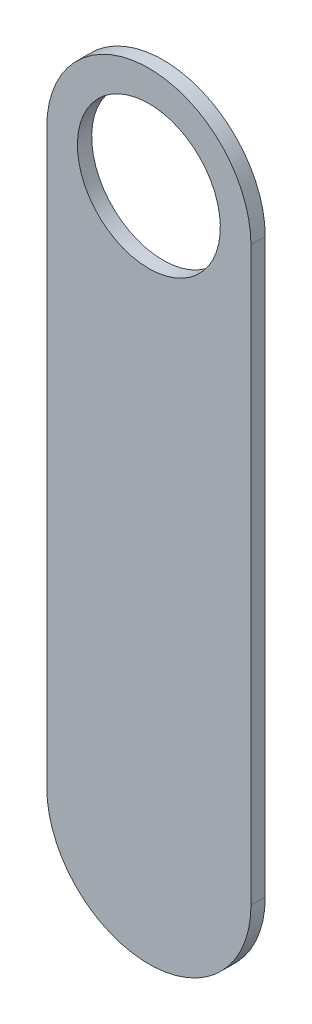
ISO-10303-21;
HEADER;
FILE_DESCRIPTION(('STEP AP214'),'2;1');
FILE_NAME('part.step','',(''),(''),'','','');
FILE_SCHEMA(('AUTOMOTIVE_DESIGN { 1 0 10303 214 1 1 1 1 }'));
ENDSEC;
DATA;
#1=APPLICATION_CONTEXT('core data for automotive mechanical design processes');
#2=APPLICATION_PROTOCOL_DEFINITION('international standard','automotive_design',2000,#1);
#3=PRODUCT_CONTEXT('',#1,'mechanical');
#4=PRODUCT('Part','Part','',(#3));
#5=PRODUCT_RELATED_PRODUCT_CATEGORY('part','',(#4));
#6=PRODUCT_DEFINITION_FORMATION('','',#4);
#7=PRODUCT_DEFINITION_CONTEXT('part definition',#1,'design');
#8=PRODUCT_DEFINITION('design','',#6,#7);
#9=PRODUCT_DEFINITION_SHAPE('','',#8);
#10=(LENGTH_UNIT() NAMED_UNIT(*) SI_UNIT(.MILLI.,.METRE.));
#11=(NAMED_UNIT(*) PLANE_ANGLE_UNIT() SI_UNIT($,.RADIAN.));
#12=(NAMED_UNIT(*) SI_UNIT($,.STERADIAN.) SOLID_ANGLE_UNIT());
#13=UNCERTAINTY_MEASURE_WITH_UNIT(LENGTH_MEASURE(1.E-05),#10,'distance_accuracy_value','');
#14=(GEOMETRIC_REPRESENTATION_CONTEXT(3) GLOBAL_UNCERTAINTY_ASSIGNED_CONTEXT((#13)) GLOBAL_UNIT_ASSIGNED_CONTEXT((#10,
#11,#12)) REPRESENTATION_CONTEXT('',''));
#15=CARTESIAN_POINT('',(0.,0.,0.));
#16=DIRECTION('',(0.,0.,1.));
#17=DIRECTION('',(1.,0.,0.));
#18=AXIS2_PLACEMENT_3D('',#15,#16,#17);
#19=CARTESIAN_POINT('',(99.15,-81.87,-0.045));
#20=DIRECTION('',(0.,0.,-1.));
#21=DIRECTION('',(0.,-1.,0.));
#22=AXIS2_PLACEMENT_3D('',#19,#20,#21);
#23=CYLINDRICAL_SURFACE('',#22,0.175);
#24=CARTESIAN_POINT('',(99.15,-81.87,1.6));
#25=DIRECTION('',(0.,0.,-1.));
#26=DIRECTION('',(0.,-1.,0.));
#27=AXIS2_PLACEMENT_3D('',#24,#25,#26);
#28=CIRCLE('',#27,0.175);
#29=CARTESIAN_POINT('',(99.15,-82.045,1.6));
#30=VERTEX_POINT('',#29);
#31=EDGE_CURVE('E129',#30,#30,#28,.T.);
#32=ORIENTED_EDGE('',*,*,#31,.T.);
#33=DIRECTION('',(0.,0.,1.));
#34=VECTOR('',#33,1.);
#35=CARTESIAN_POINT('',(99.15,-82.045,-0.045));
#36=LINE('',#35,#34);
#37=CARTESIAN_POINT('',(99.15,-82.045,1.635));
#38=VERTEX_POINT('',#37);
#39=EDGE_CURVE('E11',#30,#38,#36,.T.);
#40=ORIENTED_EDGE('',*,*,#39,.T.);
#41=CARTESIAN_POINT('',(99.15,-81.87,1.635));
#42=DIRECTION('',(0.,0.,-1.));
#43=DIRECTION('',(0.,-1.,0.));
#44=AXIS2_PLACEMENT_3D('',#41,#42,#43);
#45=CIRCLE('',#44,0.175);
#46=EDGE_CURVE('E20',#38,#38,#45,.T.);
#47=ORIENTED_EDGE('',*,*,#46,.F.);
#48=ORIENTED_EDGE('',*,*,#39,.F.);
#49=EDGE_LOOP('',(#32,#40,#47,#48));
#50=FACE_BOUND('',#49,.T.);
#51=ADVANCED_FACE('F17',(#50),#23,.F.);
#52=CARTESIAN_POINT('',(98.9,-81.87,1.6));
#53=DIRECTION('',(1.,0.,0.));
#54=DIRECTION('',(0.,1.,0.));
#55=AXIS2_PLACEMENT_3D('',#52,#53,#54);
#56=PLANE('',#55);
#57=DIRECTION('',(0.,-1.,0.));
#58=VECTOR('',#57,1.);
#59=CARTESIAN_POINT('',(98.9,-81.87,1.6));
#60=LINE('',#59,#58);
#61=CARTESIAN_POINT('',(98.9,-81.87,1.6));
#62=VERTEX_POINT('',#61);
#63=CARTESIAN_POINT('',(98.9,-83.27,1.6));
#64=VERTEX_POINT('',#63);
#65=EDGE_CURVE('E51',#62,#64,#60,.T.);
#66=ORIENTED_EDGE('',*,*,#65,.T.);
#67=DIRECTION('',(0.,0.,1.));
#68=VECTOR('',#67,1.);
#69=CARTESIAN_POINT('',(98.9,-83.27,1.6));
#70=LINE('',#69,#68);
#71=CARTESIAN_POINT('',(98.9,-83.27,1.635));
#72=VERTEX_POINT('',#71);
#73=EDGE_CURVE('E91',#64,#72,#70,.T.);
#74=ORIENTED_EDGE('',*,*,#73,.T.);
#75=DIRECTION('',(0.,-1.,0.));
#76=VECTOR('',#75,1.);
#77=CARTESIAN_POINT('',(98.9,-81.87,1.635));
#78=LINE('',#77,#76);
#79=CARTESIAN_POINT('',(98.9,-81.87,1.635));
#80=VERTEX_POINT('',#79);
#81=EDGE_CURVE('E63',#80,#72,#78,.T.);
#82=ORIENTED_EDGE('',*,*,#81,.F.);
#83=DIRECTION('',(0.,0.,1.));
#84=VECTOR('',#83,1.);
#85=CARTESIAN_POINT('',(98.9,-81.87,1.6));
#86=LINE('',#85,#84);
#87=EDGE_CURVE('E122',#62,#80,#86,.T.);
#88=ORIENTED_EDGE('',*,*,#87,.F.);
#89=EDGE_LOOP('',(#66,#74,#82,#88));
#90=FACE_BOUND('',#89,.T.);
#91=ADVANCED_FACE('F227',(#90),#56,.F.);
#92=CARTESIAN_POINT('',(99.4,-83.27,1.635));
#93=DIRECTION('',(0.,0.,1.));
#94=DIRECTION('',(1.,0.,0.));
#95=AXIS2_PLACEMENT_3D('',#92,#93,#94);
#96=PLANE('',#95);
#97=ORIENTED_EDGE('',*,*,#46,.T.);
#98=EDGE_LOOP('',(#97));
#99=FACE_BOUND('',#98,.T.);
#100=DIRECTION('',(0.,1.,0.));
#101=VECTOR('',#100,1.);
#102=CARTESIAN_POINT('',(99.4,-83.27,1.635));
#103=LINE('',#102,#101);
#104=CARTESIAN_POINT('',(99.4,-83.27,1.635));
#105=VERTEX_POINT('',#104);
#106=CARTESIAN_POINT('',(99.4,-81.87,1.635));
#107=VERTEX_POINT('',#106);
#108=EDGE_CURVE('E102',#105,#107,#103,.T.);
#109=ORIENTED_EDGE('',*,*,#108,.T.);
#110=CARTESIAN_POINT('',(99.15,-81.87,1.635));
#111=DIRECTION('',(0.,0.,1.));
#112=DIRECTION('',(1.,0.,0.));
#113=AXIS2_PLACEMENT_3D('',#110,#111,#112);
#114=CIRCLE('',#113,0.25);
#115=EDGE_CURVE('E126',#107,#80,#114,.T.);
#116=ORIENTED_EDGE('',*,*,#115,.T.);
#117=ORIENTED_EDGE('',*,*,#81,.T.);
#118=CARTESIAN_POINT('',(99.15,-83.27,1.635));
#119=DIRECTION('',(0.,0.,1.));
#120=DIRECTION('',(-1.,0.,0.));
#121=AXIS2_PLACEMENT_3D('',#118,#119,#120);
#122=CIRCLE('',#121,0.25);
#123=EDGE_CURVE('E94',#72,#105,#122,.T.);
#124=ORIENTED_EDGE('',*,*,#123,.T.);
#125=EDGE_LOOP('',(#109,#116,#117,#124));
#126=FACE_BOUND('',#125,.T.);
#127=ADVANCED_FACE('F217',(#99,#126),#96,.T.);
#128=CARTESIAN_POINT('',(99.4,-83.27,1.6));
#129=DIRECTION('',(0.,0.,1.));
#130=DIRECTION('',(1.,0.,0.));
#131=AXIS2_PLACEMENT_3D('',#128,#129,#130);
#132=PLANE('',#131);
#133=ORIENTED_EDGE('',*,*,#31,.F.);
#134=EDGE_LOOP('',(#133));
#135=FACE_BOUND('',#134,.T.);
#136=CARTESIAN_POINT('',(99.15,-83.27,1.6));
#137=DIRECTION('',(0.,0.,1.));
#138=DIRECTION('',(-1.,0.,0.));
#139=AXIS2_PLACEMENT_3D('',#136,#137,#138);
#140=CIRCLE('',#139,0.25);
#141=CARTESIAN_POINT('',(99.4,-83.27,1.6));
#142=VERTEX_POINT('',#141);
#143=EDGE_CURVE('E85',#64,#142,#140,.T.);
#144=ORIENTED_EDGE('',*,*,#143,.F.);
#145=ORIENTED_EDGE('',*,*,#65,.F.);
#146=CARTESIAN_POINT('',(99.15,-81.87,1.6));
#147=DIRECTION('',(0.,0.,1.));
#148=DIRECTION('',(1.,0.,0.));
#149=AXIS2_PLACEMENT_3D('',#146,#147,#148);
#150=CIRCLE('',#149,0.25);
#151=CARTESIAN_POINT('',(99.4,-81.87,1.6));
#152=VERTEX_POINT('',#151);
#153=EDGE_CURVE('E107',#152,#62,#150,.T.);
#154=ORIENTED_EDGE('',*,*,#153,.F.);
#155=DIRECTION('',(0.,1.,0.));
#156=VECTOR('',#155,1.);
#157=CARTESIAN_POINT('',(99.4,-83.27,1.6));
#158=LINE('',#157,#156);
#159=EDGE_CURVE('E100',#142,#152,#158,.T.);
#160=ORIENTED_EDGE('',*,*,#159,.F.);
#161=EDGE_LOOP('',(#144,#145,#154,#160));
#162=FACE_BOUND('',#161,.T.);
#163=ADVANCED_FACE('F105',(#135,#162),#132,.F.);
#164=CARTESIAN_POINT('',(99.15,-81.87,1.6));
#165=DIRECTION('',(0.,0.,-1.));
#166=DIRECTION('',(1.,0.,0.));
#167=AXIS2_PLACEMENT_3D('',#164,#165,#166);
#168=CYLINDRICAL_SURFACE('',#167,0.25);
#169=ORIENTED_EDGE('',*,*,#153,.T.);
#170=ORIENTED_EDGE('',*,*,#87,.T.);
#171=ORIENTED_EDGE('',*,*,#115,.F.);
#172=DIRECTION('',(0.,0.,1.));
#173=VECTOR('',#172,1.);
#174=CARTESIAN_POINT('',(99.4,-81.87,1.6));
#175=LINE('',#174,#173);
#176=EDGE_CURVE('E110',#152,#107,#175,.T.);
#177=ORIENTED_EDGE('',*,*,#176,.F.);
#178=EDGE_LOOP('',(#169,#170,#171,#177));
#179=FACE_BOUND('',#178,.T.);
#180=ADVANCED_FACE('F200',(#179),#168,.T.);
#181=CARTESIAN_POINT('',(99.15,-83.27,1.6));
#182=DIRECTION('',(0.,0.,-1.));
#183=DIRECTION('',(-1.,0.,0.));
#184=AXIS2_PLACEMENT_3D('',#181,#182,#183);
#185=CYLINDRICAL_SURFACE('',#184,0.25);
#186=ORIENTED_EDGE('',*,*,#143,.T.);
#187=DIRECTION('',(0.,0.,1.));
#188=VECTOR('',#187,1.);
#189=CARTESIAN_POINT('',(99.4,-83.27,1.6));
#190=LINE('',#189,#188);
#191=EDGE_CURVE('E89',#142,#105,#190,.T.);
#192=ORIENTED_EDGE('',*,*,#191,.T.);
#193=ORIENTED_EDGE('',*,*,#123,.F.);
#194=ORIENTED_EDGE('',*,*,#73,.F.);
#195=EDGE_LOOP('',(#186,#192,#193,#194));
#196=FACE_BOUND('',#195,.T.);
#197=ADVANCED_FACE('F87',(#196),#185,.T.);
#198=CARTESIAN_POINT('',(99.4,-83.27,1.6));
#199=DIRECTION('',(-1.,0.,0.));
#200=DIRECTION('',(0.,0.,1.));
#201=AXIS2_PLACEMENT_3D('',#198,#199,#200);
#202=PLANE('',#201);
#203=ORIENTED_EDGE('',*,*,#159,.T.);
#204=ORIENTED_EDGE('',*,*,#176,.T.);
#205=ORIENTED_EDGE('',*,*,#108,.F.);
#206=ORIENTED_EDGE('',*,*,#191,.F.);
#207=EDGE_LOOP('',(#203,#204,#205,#206));
#208=FACE_BOUND('',#207,.T.);
#209=ADVANCED_FACE('F98',(#208),#202,.F.);
#210=CLOSED_SHELL('',(#51,#91,#127,#163,#180,#197,#209));
#211=MANIFOLD_SOLID_BREP('B1',#210);
#212=ADVANCED_BREP_SHAPE_REPRESENTATION('',(#18,#211),#14);
#213=SHAPE_DEFINITION_REPRESENTATION(#9,#212);
ENDSEC;
END-ISO-10303-21;
